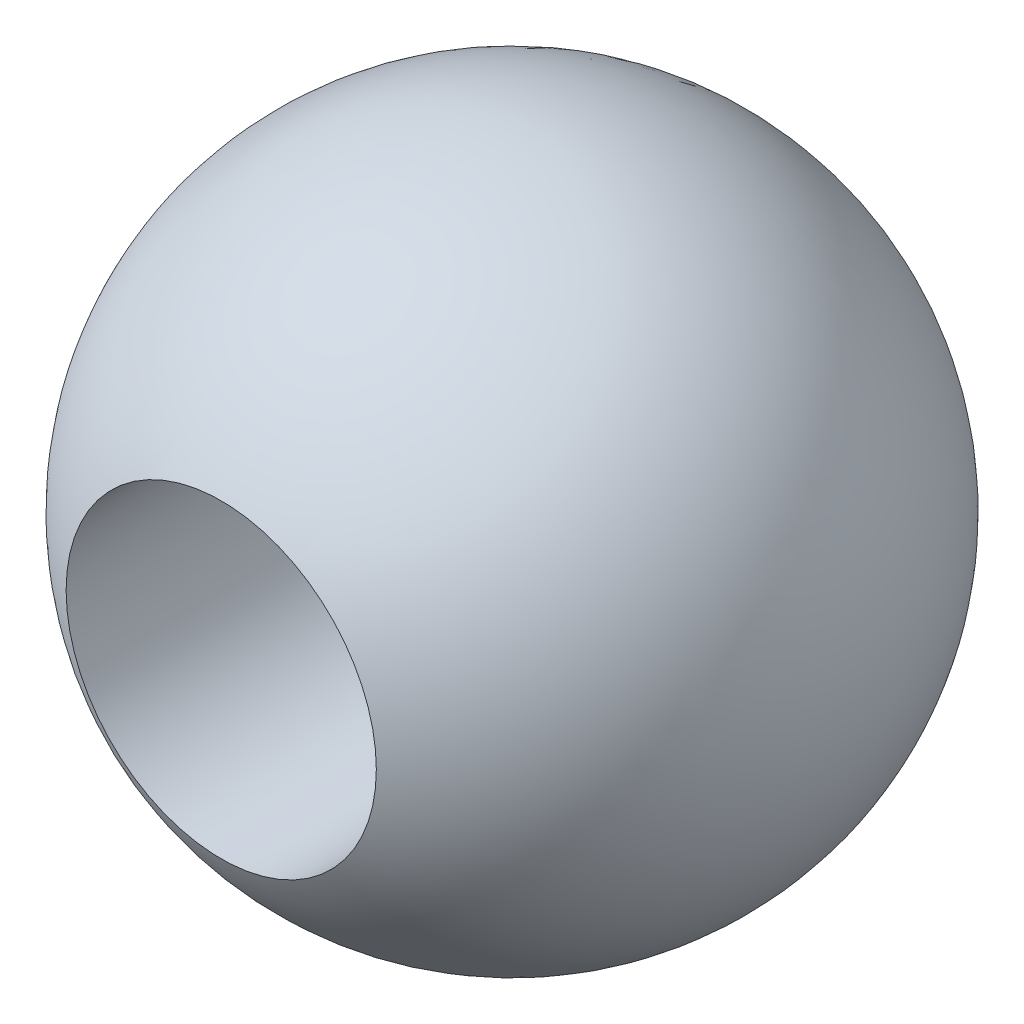
ISO-10303-21;
HEADER;
FILE_DESCRIPTION(('STEP AP214'),'2;1');
FILE_NAME('part.step','',(''),(''),'','','');
FILE_SCHEMA(('AUTOMOTIVE_DESIGN { 1 0 10303 214 1 1 1 1 }'));
ENDSEC;
DATA;
#1=APPLICATION_CONTEXT('core data for automotive mechanical design processes');
#2=APPLICATION_PROTOCOL_DEFINITION('international standard','automotive_design',2000,#1);
#3=PRODUCT_CONTEXT('',#1,'mechanical');
#4=PRODUCT('Part','Part','',(#3));
#5=PRODUCT_RELATED_PRODUCT_CATEGORY('part','',(#4));
#6=PRODUCT_DEFINITION_FORMATION('','',#4);
#7=PRODUCT_DEFINITION_CONTEXT('part definition',#1,'design');
#8=PRODUCT_DEFINITION('design','',#6,#7);
#9=PRODUCT_DEFINITION_SHAPE('','',#8);
#10=(LENGTH_UNIT() NAMED_UNIT(*) SI_UNIT(.MILLI.,.METRE.));
#11=(NAMED_UNIT(*) PLANE_ANGLE_UNIT() SI_UNIT($,.RADIAN.));
#12=(NAMED_UNIT(*) SI_UNIT($,.STERADIAN.) SOLID_ANGLE_UNIT());
#13=UNCERTAINTY_MEASURE_WITH_UNIT(LENGTH_MEASURE(1.E-05),#10,'distance_accuracy_value','');
#14=(GEOMETRIC_REPRESENTATION_CONTEXT(3) GLOBAL_UNCERTAINTY_ASSIGNED_CONTEXT((#13)) GLOBAL_UNIT_ASSIGNED_CONTEXT((#10,
#11,#12)) REPRESENTATION_CONTEXT('',''));
#15=CARTESIAN_POINT('',(0.,0.,0.));
#16=DIRECTION('',(0.,0.,1.));
#17=DIRECTION('',(1.,0.,0.));
#18=AXIS2_PLACEMENT_3D('',#15,#16,#17);
#19=CARTESIAN_POINT('',(0.,0.,0.));
#20=DIRECTION('',(-1.,0.,0.));
#21=DIRECTION('',(0.,1.,0.));
#22=AXIS2_PLACEMENT_3D('',#19,#20,#21);
#23=SPHERICAL_SURFACE('',#22,8.5);
#24=CARTESIAN_POINT('',(0.,-8.4,0.));
#25=DIRECTION('',(0.,1.,0.));
#26=DIRECTION('',(0.,0.,1.));
#27=AXIS2_PLACEMENT_3D('',#24,#25,#26);
#28=CIRCLE('',#27,1.3);
#29=CARTESIAN_POINT('',(0.,-8.4,1.3));
#30=VERTEX_POINT('',#29);
#31=EDGE_CURVE('E66',#30,#30,#28,.T.);
#32=ORIENTED_EDGE('',*,*,#31,.T.);
#33=EDGE_LOOP('',(#32));
#34=FACE_BOUND('',#33,.T.);
#35=CARTESIAN_POINT('',(0.,0.,7.5));
#36=DIRECTION('',(0.,0.,-1.));
#37=DIRECTION('',(-1.,0.,0.));
#38=AXIS2_PLACEMENT_3D('',#35,#36,#37);
#39=CIRCLE('',#38,4.);
#40=CARTESIAN_POINT('',(-4.,0.,7.5));
#41=VERTEX_POINT('',#40);
#42=EDGE_CURVE('E10',#41,#41,#39,.T.);
#43=ORIENTED_EDGE('',*,*,#42,.T.);
#44=EDGE_LOOP('',(#43));
#45=FACE_BOUND('',#44,.T.);
#46=CARTESIAN_POINT('',(0.,0.,-7.5));
#47=DIRECTION('',(0.,0.,1.));
#48=DIRECTION('',(1.,0.,0.));
#49=AXIS2_PLACEMENT_3D('',#46,#47,#48);
#50=CIRCLE('',#49,4.);
#51=CARTESIAN_POINT('',(4.,0.,-7.5));
#52=VERTEX_POINT('',#51);
#53=EDGE_CURVE('E59',#52,#52,#50,.T.);
#54=ORIENTED_EDGE('',*,*,#53,.T.);
#55=EDGE_LOOP('',(#54));
#56=FACE_BOUND('',#55,.T.);
#57=ADVANCED_FACE('F47',(#34,#45,#56),#23,.T.);
#58=CARTESIAN_POINT('',(0.,0.,-8.5));
#59=DIRECTION('',(0.,0.,1.));
#60=DIRECTION('',(1.,0.,0.));
#61=AXIS2_PLACEMENT_3D('',#58,#59,#60);
#62=CYLINDRICAL_SURFACE('',#61,4.);
#63=CARTESIAN_POINT('',(0.,-4.,1.3));
#64=CARTESIAN_POINT('',(-0.0710317531796133,-3.99999995749826,1.29999999155738));
#65=CARTESIAN_POINT('',(-0.142064319771244,-3.99809031754443,1.29415921461136));
#66=CARTESIAN_POINT('',(-0.282043244902984,-3.99066007129691,1.27101773330862));
#67=CARTESIAN_POINT('',(-0.350989282256518,-3.98513891199811,1.25371527390453));
#68=CARTESIAN_POINT('',(-0.484756730720893,-3.97108686402745,1.20830190912989));
#69=CARTESIAN_POINT('',(-0.549584633114743,-3.96256085810308,1.18020853192316));
#70=CARTESIAN_POINT('',(-0.673609049608402,-3.94337344575549,1.11408813928648));
#71=CARTESIAN_POINT('',(-0.732804538277694,-3.93271165158623,1.07605931972443));
#72=CARTESIAN_POINT('',(-0.845844324592793,-3.90998372899119,0.989823575483029));
#73=CARTESIAN_POINT('',(-0.899476148698545,-3.89788518143411,0.941346722481444));
#74=CARTESIAN_POINT('',(-0.998009376364183,-3.87382947393024,0.83616521356509));
#75=CARTESIAN_POINT('',(-1.04290898199248,-3.8618723435757,0.779458867416126));
#76=CARTESIAN_POINT('',(-1.12389120455129,-3.83910022419606,0.657545189299629));
#77=CARTESIAN_POINT('',(-1.15970201778359,-3.82832495090894,0.592149180080654));
#78=CARTESIAN_POINT('',(-1.2197275485592,-3.80962732329391,0.455856039916745));
#79=CARTESIAN_POINT('',(-1.2439456060987,-3.80170414740975,0.384960500293764));
#80=CARTESIAN_POINT('',(-1.27930904388608,-3.78994824939412,0.242089601391221));
#81=CARTESIAN_POINT('',(-1.29085096417072,-3.78599180890623,0.170222868142646));
#82=CARTESIAN_POINT('',(-1.30177383652827,-3.78225082997438,0.0254724171974994));
#83=CARTESIAN_POINT('',(-1.30115832900706,-3.78246507697006,-0.0474109982494438));
#84=CARTESIAN_POINT('',(-1.28809262055215,-3.78693252569251,-0.188786031343261));
#85=CARTESIAN_POINT('',(-1.27615436726455,-3.7910110016715,-0.257331430294481));
#86=CARTESIAN_POINT('',(-1.24161512958323,-3.80246229924942,-0.391387893527101));
#87=CARTESIAN_POINT('',(-1.21901292732087,-3.80983549711462,-0.456898610296136));
#88=CARTESIAN_POINT('',(-1.16344161675496,-3.82717376020854,-0.584212109907508));
#89=CARTESIAN_POINT('',(-1.13031715471231,-3.83717725165528,-0.645941623302719));
#90=CARTESIAN_POINT('',(-1.05474946074364,-3.85863224992365,-0.763130371869147));
#91=CARTESIAN_POINT('',(-1.01230364537251,-3.870084157805,-0.818587862259336));
#92=CARTESIAN_POINT('',(-0.916817626217514,-3.89383857895105,-0.924542322131791));
#93=CARTESIAN_POINT('',(-0.863357195552847,-3.9061551456587,-0.974658175699884));
#94=CARTESIAN_POINT('',(-0.748638379559226,-3.92975388043403,-1.06531002646678));
#95=CARTESIAN_POINT('',(-0.687379319127986,-3.94103595880375,-1.10584519342753));
#96=CARTESIAN_POINT('',(-0.558023985184921,-3.96143016559477,-1.17647183214502));
#97=CARTESIAN_POINT('',(-0.489871005415786,-3.97052179542748,-1.20646576743942));
#98=CARTESIAN_POINT('',(-0.349121400547622,-3.98536230063387,-1.25444701963945));
#99=CARTESIAN_POINT('',(-0.276526248263763,-3.99111227737589,-1.27243829276654));
#100=CARTESIAN_POINT('',(-0.132182918271084,-3.99844127975227,-1.29523892416557));
#101=CARTESIAN_POINT('',(-0.0605243096610317,-4.00018327673697,-1.30056364954332));
#102=CARTESIAN_POINT('',(0.0826739014571959,-3.99978606047933,-1.29934200185109));
#103=CARTESIAN_POINT('',(0.15421352111902,-3.9976474660515,-1.29279752149183));
#104=CARTESIAN_POINT('',(0.293110805971634,-3.98983676355579,-1.26843354983456));
#105=CARTESIAN_POINT('',(0.360529313749147,-3.98426262217605,-1.25092645035274));
#106=CARTESIAN_POINT('',(0.491448502277009,-3.97024137257806,-1.20552094405157));
#107=CARTESIAN_POINT('',(0.554948687660261,-3.96179390197973,-1.17762122648815));
#108=CARTESIAN_POINT('',(0.678036221921952,-3.94261947612255,-1.1114290919062));
#109=CARTESIAN_POINT('',(0.737482077392618,-3.93183977717441,-1.07288927005004));
#110=CARTESIAN_POINT('',(0.8492326029235,-3.90922753070674,-0.986804038410703));
#111=CARTESIAN_POINT('',(0.90153518156367,-3.89739467651042,-0.939256000873201));
#112=CARTESIAN_POINT('',(0.999856389034447,-3.87336557807198,-0.83407960878231));
#113=CARTESIAN_POINT('',(1.04550735590287,-3.86117563223107,-0.776105303505021));
#114=CARTESIAN_POINT('',(1.12647310324813,-3.83833739688013,-0.653055598937929));
#115=CARTESIAN_POINT('',(1.16178790944342,-3.82768910353419,-0.587980217317578));
#116=CARTESIAN_POINT('',(1.22088986143037,-3.8092505069153,-0.452618984241843));
#117=CARTESIAN_POINT('',(1.24470985134209,-3.80145207641862,-0.382348647814791));
#118=CARTESIAN_POINT('',(1.2800803826755,-3.78968975260594,-0.238484887370984));
#119=CARTESIAN_POINT('',(1.29163609486851,-3.78572424334592,-0.164892877467328));
#120=CARTESIAN_POINT('',(1.30175941935977,-3.78225434748287,-0.0203439530228145));
#121=CARTESIAN_POINT('',(1.3009343264965,-3.78254135999567,0.050565917238969));
#122=CARTESIAN_POINT('',(1.28780245786658,-3.78703206665166,0.191181598466727));
#123=CARTESIAN_POINT('',(1.27549630285018,-3.79123554904181,0.26088747432192));
#124=CARTESIAN_POINT('',(1.24017228292054,-3.80293404765169,0.395932842291277));
#125=CARTESIAN_POINT('',(1.21734173710049,-3.8103713796557,0.461326714711411));
#126=CARTESIAN_POINT('',(1.16176689198724,-3.82768086764088,0.587406870179441));
#127=CARTESIAN_POINT('',(1.12902046339815,-3.83755354649392,0.648092138601526));
#128=CARTESIAN_POINT('',(1.05294351879197,-3.85913635454559,0.765782473385377));
#129=CARTESIAN_POINT('',(1.00922756451649,-3.87090607008722,0.822527408549875));
#130=CARTESIAN_POINT('',(0.913114871600303,-3.89469754820139,0.928072362793263));
#131=CARTESIAN_POINT('',(0.860715733771489,-3.90671937963017,0.976870178651406));
#132=CARTESIAN_POINT('',(0.746435019269791,-3.93018500837504,1.06691871928727));
#133=CARTESIAN_POINT('',(0.684277994970703,-3.94159191016833,1.10783063525712));
#134=CARTESIAN_POINT('',(0.553600636038902,-3.96205639312843,1.17857626147091));
#135=CARTESIAN_POINT('',(0.48508229971998,-3.971114708701,1.20841343606248));
#136=CARTESIAN_POINT('',(0.347932952278427,-3.98539862047601,1.25453321439619));
#137=CARTESIAN_POINT('',(0.27956320138954,-3.99082412302041,1.27153095568022));
#138=CARTESIAN_POINT('',(0.140795566975075,-3.99812440031188,1.29426297742899));
#139=CARTESIAN_POINT('',(0.0703981829706459,-4.00000004212264,1.30000000836731));
#140=CARTESIAN_POINT('',(0.,-4.,1.3));
#141=B_SPLINE_CURVE_WITH_KNOTS('',3,(#63,#64,#65,#66,#67,#68,#69,#70,#71,#72,#73,#74,#75,#76,
#77,#78,#79,#80,#81,#82,#83,#84,#85,#86,#87,#88,#89,#90,#91,#92,#93,#94,#95,#96,#97,#98,#99,
#100,#101,#102,#103,#104,#105,#106,#107,#108,#109,#110,#111,#112,#113,#114,#115,#116,#117,#118,
#119,#120,#121,#122,#123,#124,#125,#126,#127,#128,#129,#130,#131,#132,#133,#134,#135,#136,#137,
#138,#139,#140),.UNSPECIFIED.,.T.,.F.,(4,2,2,2,2,2,2,2,2,2,2,2,2,2,2,2,2,2,2,2,2,2,2,2,2,2,2,2,
2,2,2,2,2,2,2,2,2,2,4),(0.,0.212836320501871,0.425705238678367,0.63822983679622,
0.850793053150723,1.06970118523821,1.2886543420961,1.51353896111273,1.73835874942418,
1.95592547275083,2.17342883866663,2.38154447169365,2.58968387817211,2.80105153146272,
3.01247784012411,3.23436338576861,3.45626815240874,3.68017522233036,3.90400845328363,
4.11856594913053,4.33308923379461,4.54176144591877,4.75045998524195,4.96449273597467,
5.17858801783487,5.40190417826791,5.62521978304092,5.84789347385932,6.07047324535279,
6.28217245322976,6.49386021576157,6.70191765197147,6.91001979730078,7.12682695905993,
7.34369412543824,7.56844430375459,7.79312411742492,8.00411357835245,8.21505149784323),.UNSPECIFIED.);
#142=CARTESIAN_POINT('',(0.,-4.,1.3));
#143=VERTEX_POINT('',#142);
#144=EDGE_CURVE('E50',#143,#143,#141,.T.);
#145=ORIENTED_EDGE('',*,*,#144,.T.);
#146=EDGE_LOOP('',(#145));
#147=FACE_BOUND('',#146,.T.);
#148=ORIENTED_EDGE('',*,*,#53,.F.);
#149=EDGE_LOOP('',(#148));
#150=FACE_BOUND('',#149,.T.);
#151=ORIENTED_EDGE('',*,*,#42,.F.);
#152=EDGE_LOOP('',(#151));
#153=FACE_BOUND('',#152,.T.);
#154=ADVANCED_FACE('F81',(#147,#150,#153),#62,.F.);
#155=CARTESIAN_POINT('',(0.,-8.5,0.));
#156=DIRECTION('',(0.,1.,0.));
#157=DIRECTION('',(0.,0.,1.));
#158=AXIS2_PLACEMENT_3D('',#155,#156,#157);
#159=CYLINDRICAL_SURFACE('',#158,1.3);
#160=ORIENTED_EDGE('',*,*,#144,.F.);
#161=EDGE_LOOP('',(#160));
#162=FACE_BOUND('',#161,.T.);
#163=ORIENTED_EDGE('',*,*,#31,.F.);
#164=EDGE_LOOP('',(#163));
#165=FACE_BOUND('',#164,.T.);
#166=ADVANCED_FACE('F84',(#162,#165),#159,.F.);
#167=CLOSED_SHELL('',(#57,#154,#166));
#168=MANIFOLD_SOLID_BREP('B2',#167);
#169=ADVANCED_BREP_SHAPE_REPRESENTATION('',(#18,#168),#14);
#170=SHAPE_DEFINITION_REPRESENTATION(#9,#169);
ENDSEC;
END-ISO-10303-21;
